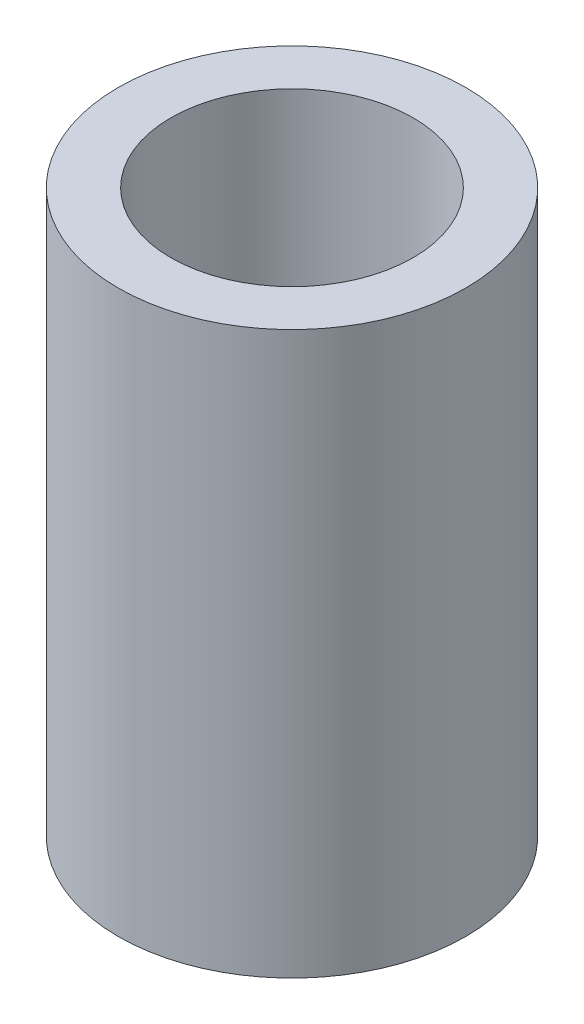
ISO-10303-21;
HEADER;
FILE_DESCRIPTION(('STEP AP214'),'2;1');
FILE_NAME('part.step','',(''),(''),'','','');
FILE_SCHEMA(('AUTOMOTIVE_DESIGN { 1 0 10303 214 1 1 1 1 }'));
ENDSEC;
DATA;
#1=APPLICATION_CONTEXT('core data for automotive mechanical design processes');
#2=APPLICATION_PROTOCOL_DEFINITION('international standard','automotive_design',2000,#1);
#3=PRODUCT_CONTEXT('',#1,'mechanical');
#4=PRODUCT('Part','Part','',(#3));
#5=PRODUCT_RELATED_PRODUCT_CATEGORY('part','',(#4));
#6=PRODUCT_DEFINITION_FORMATION('','',#4);
#7=PRODUCT_DEFINITION_CONTEXT('part definition',#1,'design');
#8=PRODUCT_DEFINITION('design','',#6,#7);
#9=PRODUCT_DEFINITION_SHAPE('','',#8);
#10=(LENGTH_UNIT() NAMED_UNIT(*) SI_UNIT(.MILLI.,.METRE.));
#11=(NAMED_UNIT(*) PLANE_ANGLE_UNIT() SI_UNIT($,.RADIAN.));
#12=(NAMED_UNIT(*) SI_UNIT($,.STERADIAN.) SOLID_ANGLE_UNIT());
#13=UNCERTAINTY_MEASURE_WITH_UNIT(LENGTH_MEASURE(1.E-05),#10,'distance_accuracy_value','');
#14=(GEOMETRIC_REPRESENTATION_CONTEXT(3) GLOBAL_UNCERTAINTY_ASSIGNED_CONTEXT((#13)) GLOBAL_UNIT_ASSIGNED_CONTEXT((#10,
#11,#12)) REPRESENTATION_CONTEXT('',''));
#15=CARTESIAN_POINT('',(0.,0.,0.));
#16=DIRECTION('',(0.,0.,1.));
#17=DIRECTION('',(1.,0.,0.));
#18=AXIS2_PLACEMENT_3D('',#15,#16,#17);
#19=CARTESIAN_POINT('',(-4.09779881692884,23.2213738553384,0.355137676365302));
#20=DIRECTION('',(0.,-1.,0.));
#21=DIRECTION('',(0.,0.,-1.));
#22=AXIS2_PLACEMENT_3D('',#19,#20,#21);
#23=PLANE('',#22);
#24=CARTESIAN_POINT('',(-4.09779881692884,23.2213738553384,0.355137676365302));
#25=DIRECTION('',(0.,-1.,0.));
#26=DIRECTION('',(0.,0.,-1.));
#27=AXIS2_PLACEMENT_3D('',#24,#25,#26);
#28=CIRCLE('',#27,13.4366);
#29=CARTESIAN_POINT('',(-4.09779881692884,23.2213738553384,-13.0814623236347));
#30=VERTEX_POINT('',#29);
#31=EDGE_CURVE('E43',#30,#30,#28,.T.);
#32=ORIENTED_EDGE('',*,*,#31,.F.);
#33=EDGE_LOOP('',(#32));
#34=FACE_BOUND('',#33,.T.);
#35=CARTESIAN_POINT('',(-4.09779881692884,23.2213738553384,0.355137676365302));
#36=DIRECTION('',(0.,-1.,0.));
#37=DIRECTION('',(0.,0.,-1.));
#38=AXIS2_PLACEMENT_3D('',#35,#36,#37);
#39=CIRCLE('',#38,9.3726);
#40=CARTESIAN_POINT('',(-4.09779881692884,23.2213738553384,-9.0174623236347));
#41=VERTEX_POINT('',#40);
#42=EDGE_CURVE('E52',#41,#41,#39,.T.);
#43=ORIENTED_EDGE('',*,*,#42,.T.);
#44=EDGE_LOOP('',(#43));
#45=FACE_BOUND('',#44,.T.);
#46=ADVANCED_FACE('F36',(#34,#45),#23,.F.);
#47=CARTESIAN_POINT('',(-4.09779881692884,-58.2170700490263,0.355137676365302));
#48=DIRECTION('',(0.,1.,0.));
#49=DIRECTION('',(0.,0.,1.));
#50=AXIS2_PLACEMENT_3D('',#47,#48,#49);
#51=CYLINDRICAL_SURFACE('',#50,13.4366);
#52=CARTESIAN_POINT('',(-4.09779881692884,-20.2126261446616,0.355137676365302));
#53=DIRECTION('',(0.,1.,0.));
#54=DIRECTION('',(0.,0.,1.));
#55=AXIS2_PLACEMENT_3D('',#52,#53,#54);
#56=CIRCLE('',#55,13.4366);
#57=CARTESIAN_POINT('',(-4.09779881692884,-20.2126261446616,13.7917376763653));
#58=VERTEX_POINT('',#57);
#59=EDGE_CURVE('E47',#58,#58,#56,.T.);
#60=ORIENTED_EDGE('',*,*,#59,.T.);
#61=EDGE_LOOP('',(#60));
#62=FACE_BOUND('',#61,.T.);
#63=ORIENTED_EDGE('',*,*,#31,.T.);
#64=EDGE_LOOP('',(#63));
#65=FACE_BOUND('',#64,.T.);
#66=ADVANCED_FACE('F60',(#62,#65),#51,.T.);
#67=CARTESIAN_POINT('',(-4.09779881692884,-58.2170700490263,0.355137676365302));
#68=DIRECTION('',(0.,1.,0.));
#69=DIRECTION('',(0.,0.,1.));
#70=AXIS2_PLACEMENT_3D('',#67,#68,#69);
#71=CYLINDRICAL_SURFACE('',#70,9.3726);
#72=CARTESIAN_POINT('',(-4.09779881692884,-20.2126261446616,0.355137676365302));
#73=DIRECTION('',(0.,1.,0.));
#74=DIRECTION('',(0.,0.,1.));
#75=AXIS2_PLACEMENT_3D('',#72,#73,#74);
#76=CIRCLE('',#75,9.3726);
#77=CARTESIAN_POINT('',(-4.09779881692884,-20.2126261446616,9.7277376763653));
#78=VERTEX_POINT('',#77);
#79=EDGE_CURVE('E10',#78,#78,#76,.T.);
#80=ORIENTED_EDGE('',*,*,#79,.F.);
#81=EDGE_LOOP('',(#80));
#82=FACE_BOUND('',#81,.T.);
#83=ORIENTED_EDGE('',*,*,#42,.F.);
#84=EDGE_LOOP('',(#83));
#85=FACE_BOUND('',#84,.T.);
#86=ADVANCED_FACE('F58',(#82,#85),#71,.F.);
#87=CARTESIAN_POINT('',(0.,-20.2126261446616,0.));
#88=DIRECTION('',(0.,1.,0.));
#89=DIRECTION('',(0.,0.,1.));
#90=AXIS2_PLACEMENT_3D('',#87,#88,#89);
#91=PLANE('',#90);
#92=ORIENTED_EDGE('',*,*,#79,.T.);
#93=EDGE_LOOP('',(#92));
#94=FACE_BOUND('',#93,.T.);
#95=ORIENTED_EDGE('',*,*,#59,.F.);
#96=EDGE_LOOP('',(#95));
#97=FACE_BOUND('',#96,.T.);
#98=ADVANCED_FACE('F38',(#94,#97),#91,.F.);
#99=CLOSED_SHELL('',(#46,#66,#86,#98));
#100=MANIFOLD_SOLID_BREP('B2',#99);
#101=ADVANCED_BREP_SHAPE_REPRESENTATION('',(#18,#100),#14);
#102=SHAPE_DEFINITION_REPRESENTATION(#9,#101);
ENDSEC;
END-ISO-10303-21;
